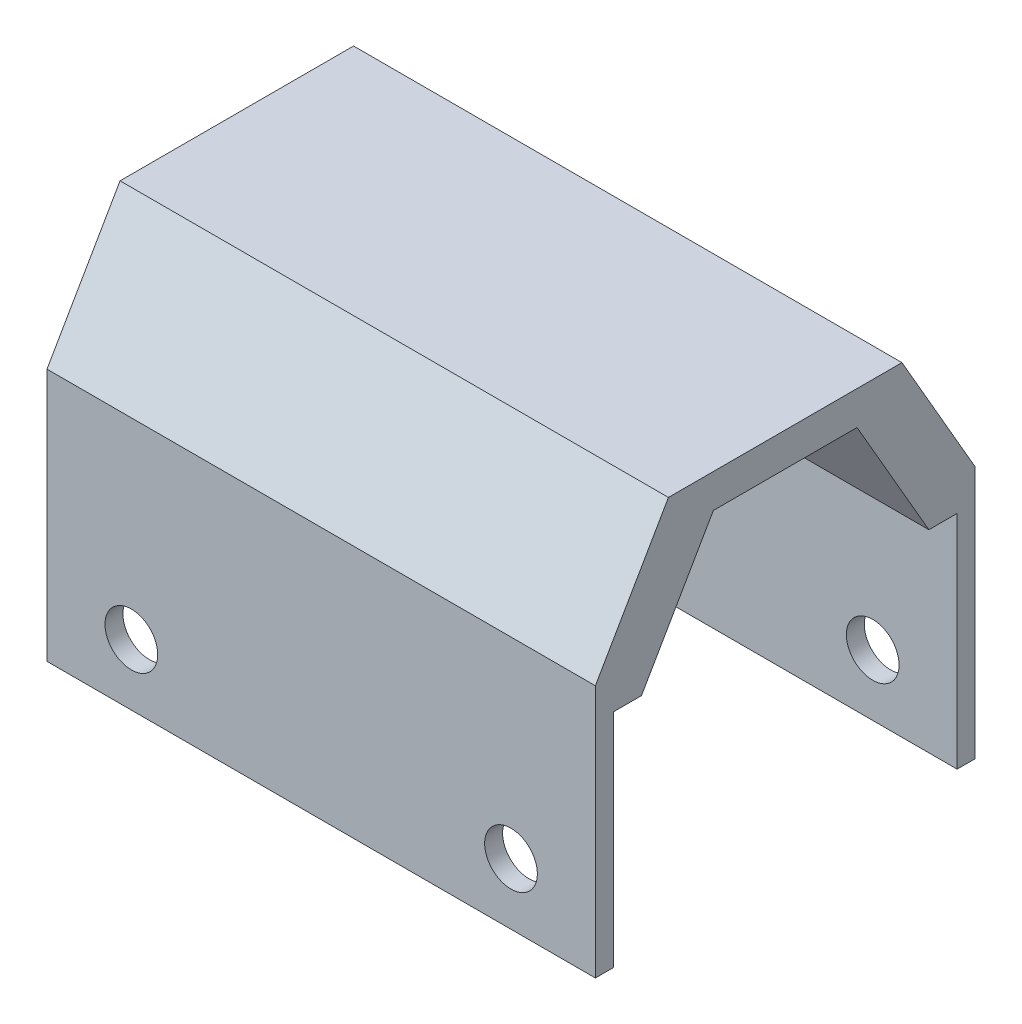
ISO-10303-21;
HEADER;
FILE_DESCRIPTION(('STEP AP214'),'2;1');
FILE_NAME('part.step','',(''),(''),'','','');
FILE_SCHEMA(('AUTOMOTIVE_DESIGN { 1 0 10303 214 1 1 1 1 }'));
ENDSEC;
DATA;
#1=APPLICATION_CONTEXT('core data for automotive mechanical design processes');
#2=APPLICATION_PROTOCOL_DEFINITION('international standard','automotive_design',2000,#1);
#3=PRODUCT_CONTEXT('',#1,'mechanical');
#4=PRODUCT('Part','Part','',(#3));
#5=PRODUCT_RELATED_PRODUCT_CATEGORY('part','',(#4));
#6=PRODUCT_DEFINITION_FORMATION('','',#4);
#7=PRODUCT_DEFINITION_CONTEXT('part definition',#1,'design');
#8=PRODUCT_DEFINITION('design','',#6,#7);
#9=PRODUCT_DEFINITION_SHAPE('','',#8);
#10=(LENGTH_UNIT() NAMED_UNIT(*) SI_UNIT(.MILLI.,.METRE.));
#11=(NAMED_UNIT(*) PLANE_ANGLE_UNIT() SI_UNIT($,.RADIAN.));
#12=(NAMED_UNIT(*) SI_UNIT($,.STERADIAN.) SOLID_ANGLE_UNIT());
#13=UNCERTAINTY_MEASURE_WITH_UNIT(LENGTH_MEASURE(1.E-05),#10,'distance_accuracy_value','');
#14=(GEOMETRIC_REPRESENTATION_CONTEXT(3) GLOBAL_UNCERTAINTY_ASSIGNED_CONTEXT((#13)) GLOBAL_UNIT_ASSIGNED_CONTEXT((#10,
#11,#12)) REPRESENTATION_CONTEXT('',''));
#15=CARTESIAN_POINT('',(0.,0.,0.));
#16=DIRECTION('',(0.,0.,1.));
#17=DIRECTION('',(1.,0.,0.));
#18=AXIS2_PLACEMENT_3D('',#15,#16,#17);
#19=CARTESIAN_POINT('',(-13.,-9.,18.));
#20=DIRECTION('',(0.,1.,0.));
#21=DIRECTION('',(0.,0.,1.));
#22=AXIS2_PLACEMENT_3D('',#19,#20,#21);
#23=PLANE('',#22);
#24=DIRECTION('',(0.,0.,-1.));
#25=VECTOR('',#24,1.);
#26=CARTESIAN_POINT('',(13.,-9.,18.));
#27=LINE('',#26,#25);
#28=CARTESIAN_POINT('',(13.,-9.,0.85));
#29=VERTEX_POINT('',#28);
#30=CARTESIAN_POINT('',(13.,-9.,0.));
#31=VERTEX_POINT('',#30);
#32=EDGE_CURVE('E254',#29,#31,#27,.T.);
#33=ORIENTED_EDGE('',*,*,#32,.F.);
#34=DIRECTION('',(1.,0.,0.));
#35=VECTOR('',#34,1.);
#36=CARTESIAN_POINT('',(-13.,-9.,0.85));
#37=LINE('',#36,#35);
#38=CARTESIAN_POINT('',(-13.,-9.,0.85));
#39=VERTEX_POINT('',#38);
#40=EDGE_CURVE('E225',#39,#29,#37,.T.);
#41=ORIENTED_EDGE('',*,*,#40,.F.);
#42=DIRECTION('',(0.,0.,-1.));
#43=VECTOR('',#42,1.);
#44=CARTESIAN_POINT('',(-13.,-9.,18.));
#45=LINE('',#44,#43);
#46=CARTESIAN_POINT('',(-13.,-9.,0.));
#47=VERTEX_POINT('',#46);
#48=EDGE_CURVE('E267',#39,#47,#45,.T.);
#49=ORIENTED_EDGE('',*,*,#48,.T.);
#50=DIRECTION('',(1.,0.,0.));
#51=VECTOR('',#50,1.);
#52=CARTESIAN_POINT('',(-13.,-9.,0.));
#53=LINE('',#52,#51);
#54=EDGE_CURVE('E248',#47,#31,#53,.T.);
#55=ORIENTED_EDGE('',*,*,#54,.T.);
#56=EDGE_LOOP('',(#33,#41,#49,#55));
#57=FACE_BOUND('',#56,.T.);
#58=ADVANCED_FACE('F44',(#57),#23,.F.);
#59=CARTESIAN_POINT('',(13.,-9.,18.));
#60=DIRECTION('',(-1.,0.,0.));
#61=DIRECTION('',(0.,0.,1.));
#62=AXIS2_PLACEMENT_3D('',#59,#60,#61);
#63=PLANE('',#62);
#64=DIRECTION('',(0.,0.,-1.));
#65=VECTOR('',#64,1.);
#66=CARTESIAN_POINT('',(13.,9.,18.));
#67=LINE('',#66,#65);
#68=CARTESIAN_POINT('',(13.,9.,14.5358983848622));
#69=VERTEX_POINT('',#68);
#70=CARTESIAN_POINT('',(13.,9.,3.46410161513776));
#71=VERTEX_POINT('',#70);
#72=EDGE_CURVE('E276',#69,#71,#67,.T.);
#73=ORIENTED_EDGE('',*,*,#72,.F.);
#74=DIRECTION('',(0.,0.86602540378444,-0.499999999999998));
#75=VECTOR('',#74,1.);
#76=CARTESIAN_POINT('',(13.,2.99999999999996,18.));
#77=LINE('',#76,#75);
#78=CARTESIAN_POINT('',(13.,2.99999999999996,18.));
#79=VERTEX_POINT('',#78);
#80=EDGE_CURVE('E54',#69,#79,#77,.F.);
#81=ORIENTED_EDGE('',*,*,#80,.T.);
#82=DIRECTION('',(0.,1.,0.));
#83=VECTOR('',#82,1.);
#84=CARTESIAN_POINT('',(13.,-9.,18.));
#85=LINE('',#84,#83);
#86=CARTESIAN_POINT('',(13.,-9.,18.));
#87=VERTEX_POINT('',#86);
#88=EDGE_CURVE('E243',#87,#79,#85,.T.);
#89=ORIENTED_EDGE('',*,*,#88,.F.);
#90=CARTESIAN_POINT('',(13.,-9.,17.15));
#91=VERTEX_POINT('',#90);
#92=EDGE_CURVE('E263',#87,#91,#27,.T.);
#93=ORIENTED_EDGE('',*,*,#92,.T.);
#94=DIRECTION('',(0.,-1.,0.));
#95=VECTOR('',#94,1.);
#96=CARTESIAN_POINT('',(13.,-9.,17.15));
#97=LINE('',#96,#95);
#98=CARTESIAN_POINT('',(13.,1.5,17.15));
#99=VERTEX_POINT('',#98);
#100=EDGE_CURVE('E180',#99,#91,#97,.T.);
#101=ORIENTED_EDGE('',*,*,#100,.F.);
#102=DIRECTION('',(0.,0.,1.));
#103=VECTOR('',#102,1.);
#104=CARTESIAN_POINT('',(13.,1.5,17.15));
#105=LINE('',#104,#103);
#106=CARTESIAN_POINT('',(13.,1.5,15.8127331764376));
#107=VERTEX_POINT('',#106);
#108=EDGE_CURVE('E215',#107,#99,#105,.T.);
#109=ORIENTED_EDGE('',*,*,#108,.F.);
#110=DIRECTION('',(0.,-0.866025403784439,0.5));
#111=VECTOR('',#110,1.);
#112=CARTESIAN_POINT('',(13.,7.4,12.4063665882188));
#113=LINE('',#112,#111);
#114=CARTESIAN_POINT('',(13.,7.4,12.4063665882188));
#115=VERTEX_POINT('',#114);
#116=EDGE_CURVE('E211',#115,#107,#113,.T.);
#117=ORIENTED_EDGE('',*,*,#116,.F.);
#118=DIRECTION('',(0.,0.,1.));
#119=VECTOR('',#118,1.);
#120=CARTESIAN_POINT('',(13.,7.4,5.59363341178121));
#121=LINE('',#120,#119);
#122=CARTESIAN_POINT('',(13.,7.4,5.59363341178121));
#123=VERTEX_POINT('',#122);
#124=EDGE_CURVE('E207',#123,#115,#121,.T.);
#125=ORIENTED_EDGE('',*,*,#124,.F.);
#126=DIRECTION('',(0.,0.866025403784438,0.5));
#127=VECTOR('',#126,1.);
#128=CARTESIAN_POINT('',(13.,1.5,2.18726682356241));
#129=LINE('',#128,#127);
#130=CARTESIAN_POINT('',(13.,1.5,2.18726682356241));
#131=VERTEX_POINT('',#130);
#132=EDGE_CURVE('E204',#131,#123,#129,.T.);
#133=ORIENTED_EDGE('',*,*,#132,.F.);
#134=DIRECTION('',(0.,0.,1.));
#135=VECTOR('',#134,1.);
#136=CARTESIAN_POINT('',(13.,1.5,2.18726682356241));
#137=LINE('',#136,#135);
#138=CARTESIAN_POINT('',(13.,1.5,0.850000000000004));
#139=VERTEX_POINT('',#138);
#140=EDGE_CURVE('E155',#139,#131,#137,.T.);
#141=ORIENTED_EDGE('',*,*,#140,.F.);
#142=DIRECTION('',(0.,1.,0.));
#143=VECTOR('',#142,1.);
#144=CARTESIAN_POINT('',(13.,-9.,0.85));
#145=LINE('',#144,#143);
#146=EDGE_CURVE('E176',#29,#139,#145,.T.);
#147=ORIENTED_EDGE('',*,*,#146,.F.);
#148=ORIENTED_EDGE('',*,*,#32,.T.);
#149=DIRECTION('',(0.,1.,0.));
#150=VECTOR('',#149,1.);
#151=CARTESIAN_POINT('',(13.,-9.,0.));
#152=LINE('',#151,#150);
#153=CARTESIAN_POINT('',(13.,2.99999999999996,0.));
#154=VERTEX_POINT('',#153);
#155=EDGE_CURVE('E224',#31,#154,#152,.T.);
#156=ORIENTED_EDGE('',*,*,#155,.T.);
#157=DIRECTION('',(0.,0.86602540378444,0.499999999999998));
#158=VECTOR('',#157,1.);
#159=CARTESIAN_POINT('',(13.,9.,3.46410161513776));
#160=LINE('',#159,#158);
#161=EDGE_CURVE('E66',#154,#71,#160,.T.);
#162=ORIENTED_EDGE('',*,*,#161,.T.);
#163=EDGE_LOOP('',(#73,#81,#89,#93,#101,#109,#117,#125,#133,#141,#147,#148,#156,#162));
#164=FACE_BOUND('',#163,.T.);
#165=ADVANCED_FACE('F310',(#164),#63,.F.);
#166=CARTESIAN_POINT('',(-13.,9.,18.));
#167=DIRECTION('',(0.,-1.,0.));
#168=DIRECTION('',(0.,0.,-1.));
#169=AXIS2_PLACEMENT_3D('',#166,#167,#168);
#170=PLANE('',#169);
#171=DIRECTION('',(0.,0.,-1.));
#172=VECTOR('',#171,1.);
#173=CARTESIAN_POINT('',(-13.,9.,18.));
#174=LINE('',#173,#172);
#175=CARTESIAN_POINT('',(-13.,9.,14.5358983848622));
#176=VERTEX_POINT('',#175);
#177=CARTESIAN_POINT('',(-13.,9.,3.46410161513776));
#178=VERTEX_POINT('',#177);
#179=EDGE_CURVE('E272',#176,#178,#174,.T.);
#180=ORIENTED_EDGE('',*,*,#179,.F.);
#181=DIRECTION('',(1.,0.,0.));
#182=VECTOR('',#181,1.);
#183=CARTESIAN_POINT('',(-13.,9.,14.5358983848622));
#184=LINE('',#183,#182);
#185=EDGE_CURVE('E303',#176,#69,#184,.T.);
#186=ORIENTED_EDGE('',*,*,#185,.T.);
#187=ORIENTED_EDGE('',*,*,#72,.T.);
#188=DIRECTION('',(-1.,0.,0.));
#189=VECTOR('',#188,1.);
#190=CARTESIAN_POINT('',(-13.,9.,3.46410161513776));
#191=LINE('',#190,#189);
#192=EDGE_CURVE('E299',#71,#178,#191,.T.);
#193=ORIENTED_EDGE('',*,*,#192,.T.);
#194=EDGE_LOOP('',(#180,#186,#187,#193));
#195=FACE_BOUND('',#194,.T.);
#196=ADVANCED_FACE('F322',(#195),#170,.F.);
#197=CARTESIAN_POINT('',(-13.,-9.,18.));
#198=DIRECTION('',(1.,0.,0.));
#199=DIRECTION('',(0.,0.,-1.));
#200=AXIS2_PLACEMENT_3D('',#197,#198,#199);
#201=PLANE('',#200);
#202=DIRECTION('',(0.,-1.,0.));
#203=VECTOR('',#202,1.);
#204=CARTESIAN_POINT('',(-13.,-9.,18.));
#205=LINE('',#204,#203);
#206=CARTESIAN_POINT('',(-13.,2.99999999999996,18.));
#207=VERTEX_POINT('',#206);
#208=CARTESIAN_POINT('',(-13.,-9.,18.));
#209=VERTEX_POINT('',#208);
#210=EDGE_CURVE('E247',#207,#209,#205,.T.);
#211=ORIENTED_EDGE('',*,*,#210,.F.);
#212=DIRECTION('',(0.,-0.86602540378444,0.499999999999998));
#213=VECTOR('',#212,1.);
#214=CARTESIAN_POINT('',(-13.,2.99999999999996,18.));
#215=LINE('',#214,#213);
#216=EDGE_CURVE('E296',#207,#176,#215,.F.);
#217=ORIENTED_EDGE('',*,*,#216,.T.);
#218=ORIENTED_EDGE('',*,*,#179,.T.);
#219=DIRECTION('',(0.,-0.86602540378444,-0.499999999999998));
#220=VECTOR('',#219,1.);
#221=CARTESIAN_POINT('',(-13.,9.,3.46410161513776));
#222=LINE('',#221,#220);
#223=CARTESIAN_POINT('',(-13.,2.99999999999996,0.));
#224=VERTEX_POINT('',#223);
#225=EDGE_CURVE('E293',#178,#224,#222,.T.);
#226=ORIENTED_EDGE('',*,*,#225,.T.);
#227=DIRECTION('',(0.,-1.,0.));
#228=VECTOR('',#227,1.);
#229=CARTESIAN_POINT('',(-13.,-9.,0.));
#230=LINE('',#229,#228);
#231=EDGE_CURVE('E257',#224,#47,#230,.T.);
#232=ORIENTED_EDGE('',*,*,#231,.T.);
#233=ORIENTED_EDGE('',*,*,#48,.F.);
#234=DIRECTION('',(0.,1.,0.));
#235=VECTOR('',#234,1.);
#236=CARTESIAN_POINT('',(-13.,-9.,0.85));
#237=LINE('',#236,#235);
#238=CARTESIAN_POINT('',(-13.,1.5,0.850000000000004));
#239=VERTEX_POINT('',#238);
#240=EDGE_CURVE('E161',#39,#239,#237,.T.);
#241=ORIENTED_EDGE('',*,*,#240,.T.);
#242=DIRECTION('',(0.,0.,1.));
#243=VECTOR('',#242,1.);
#244=CARTESIAN_POINT('',(-13.,1.5,2.18726682356241));
#245=LINE('',#244,#243);
#246=CARTESIAN_POINT('',(-13.,1.5,2.18726682356241));
#247=VERTEX_POINT('',#246);
#248=EDGE_CURVE('E152',#239,#247,#245,.T.);
#249=ORIENTED_EDGE('',*,*,#248,.T.);
#250=DIRECTION('',(0.,0.866025403784438,0.5));
#251=VECTOR('',#250,1.);
#252=CARTESIAN_POINT('',(-13.,1.5,2.18726682356241));
#253=LINE('',#252,#251);
#254=CARTESIAN_POINT('',(-13.,7.4,5.59363341178121));
#255=VERTEX_POINT('',#254);
#256=EDGE_CURVE('E164',#247,#255,#253,.T.);
#257=ORIENTED_EDGE('',*,*,#256,.T.);
#258=DIRECTION('',(0.,0.,1.));
#259=VECTOR('',#258,1.);
#260=CARTESIAN_POINT('',(-13.,7.4,5.59363341178121));
#261=LINE('',#260,#259);
#262=CARTESIAN_POINT('',(-13.,7.4,12.4063665882188));
#263=VERTEX_POINT('',#262);
#264=EDGE_CURVE('E170',#255,#263,#261,.T.);
#265=ORIENTED_EDGE('',*,*,#264,.T.);
#266=DIRECTION('',(0.,-0.866025403784439,0.5));
#267=VECTOR('',#266,1.);
#268=CARTESIAN_POINT('',(-13.,7.4,12.4063665882188));
#269=LINE('',#268,#267);
#270=CARTESIAN_POINT('',(-13.,1.5,15.8127331764376));
#271=VERTEX_POINT('',#270);
#272=EDGE_CURVE('E188',#263,#271,#269,.T.);
#273=ORIENTED_EDGE('',*,*,#272,.T.);
#274=DIRECTION('',(0.,0.,1.));
#275=VECTOR('',#274,1.);
#276=CARTESIAN_POINT('',(-13.,1.5,17.15));
#277=LINE('',#276,#275);
#278=CARTESIAN_POINT('',(-13.,1.5,17.15));
#279=VERTEX_POINT('',#278);
#280=EDGE_CURVE('E192',#271,#279,#277,.T.);
#281=ORIENTED_EDGE('',*,*,#280,.T.);
#282=DIRECTION('',(0.,-1.,0.));
#283=VECTOR('',#282,1.);
#284=CARTESIAN_POINT('',(-13.,-9.,17.15));
#285=LINE('',#284,#283);
#286=CARTESIAN_POINT('',(-13.,-9.,17.15));
#287=VERTEX_POINT('',#286);
#288=EDGE_CURVE('E196',#279,#287,#285,.T.);
#289=ORIENTED_EDGE('',*,*,#288,.T.);
#290=EDGE_CURVE('E268',#209,#287,#45,.T.);
#291=ORIENTED_EDGE('',*,*,#290,.F.);
#292=EDGE_LOOP('',(#211,#217,#218,#226,#232,#233,#241,#249,#257,#265,#273,#281,#289,#291));
#293=FACE_BOUND('',#292,.T.);
#294=ADVANCED_FACE('F173',(#293),#201,.F.);
#295=ORIENTED_EDGE('',*,*,#290,.T.);
#296=DIRECTION('',(1.,0.,0.));
#297=VECTOR('',#296,1.);
#298=CARTESIAN_POINT('',(-13.,-9.,17.15));
#299=LINE('',#298,#297);
#300=EDGE_CURVE('E228',#287,#91,#299,.T.);
#301=ORIENTED_EDGE('',*,*,#300,.T.);
#302=ORIENTED_EDGE('',*,*,#92,.F.);
#303=DIRECTION('',(1.,0.,0.));
#304=VECTOR('',#303,1.);
#305=CARTESIAN_POINT('',(-13.,-9.,18.));
#306=LINE('',#305,#304);
#307=EDGE_CURVE('E251',#209,#87,#306,.T.);
#308=ORIENTED_EDGE('',*,*,#307,.F.);
#309=EDGE_LOOP('',(#295,#301,#302,#308));
#310=FACE_BOUND('',#309,.T.);
#311=ADVANCED_FACE('F353',(#310),#23,.F.);
#312=CARTESIAN_POINT('',(0.,0.,18.));
#313=DIRECTION('',(0.,0.,-1.));
#314=DIRECTION('',(-1.,0.,0.));
#315=AXIS2_PLACEMENT_3D('',#312,#313,#314);
#316=PLANE('',#315);
#317=CARTESIAN_POINT('',(-8.99999999999999,-6.1,18.));
#318=DIRECTION('',(0.,0.,1.));
#319=DIRECTION('',(1.,0.,0.));
#320=AXIS2_PLACEMENT_3D('',#317,#318,#319);
#321=CIRCLE('',#320,1.25);
#322=CARTESIAN_POINT('',(-7.74999999999999,-6.1,18.));
#323=VERTEX_POINT('',#322);
#324=EDGE_CURVE('E407',#323,#323,#321,.T.);
#325=ORIENTED_EDGE('',*,*,#324,.F.);
#326=EDGE_LOOP('',(#325));
#327=FACE_BOUND('',#326,.T.);
#328=CARTESIAN_POINT('',(9.00000000000001,-6.1,18.));
#329=DIRECTION('',(0.,0.,1.));
#330=DIRECTION('',(1.,0.,0.));
#331=AXIS2_PLACEMENT_3D('',#328,#329,#330);
#332=CIRCLE('',#331,1.25);
#333=CARTESIAN_POINT('',(10.25,-6.1,18.));
#334=VERTEX_POINT('',#333);
#335=EDGE_CURVE('E403',#334,#334,#332,.T.);
#336=ORIENTED_EDGE('',*,*,#335,.F.);
#337=EDGE_LOOP('',(#336));
#338=FACE_BOUND('',#337,.T.);
#339=ORIENTED_EDGE('',*,*,#88,.T.);
#340=DIRECTION('',(-1.,0.,0.));
#341=VECTOR('',#340,1.);
#342=CARTESIAN_POINT('',(0.,2.99999999999996,18.));
#343=LINE('',#342,#341);
#344=EDGE_CURVE('E279',#79,#207,#343,.T.);
#345=ORIENTED_EDGE('',*,*,#344,.T.);
#346=ORIENTED_EDGE('',*,*,#210,.T.);
#347=ORIENTED_EDGE('',*,*,#307,.T.);
#348=EDGE_LOOP('',(#339,#345,#346,#347));
#349=FACE_BOUND('',#348,.T.);
#350=ADVANCED_FACE('F315',(#327,#338,#349),#316,.F.);
#351=CARTESIAN_POINT('',(0.,0.,0.));
#352=DIRECTION('',(0.,0.,-1.));
#353=DIRECTION('',(-1.,0.,0.));
#354=AXIS2_PLACEMENT_3D('',#351,#352,#353);
#355=PLANE('',#354);
#356=CARTESIAN_POINT('',(-8.99999999999999,-6.1,0.));
#357=DIRECTION('',(0.,0.,1.));
#358=DIRECTION('',(1.,0.,0.));
#359=AXIS2_PLACEMENT_3D('',#356,#357,#358);
#360=CIRCLE('',#359,1.25);
#361=CARTESIAN_POINT('',(-7.74999999999999,-6.1,0.));
#362=VERTEX_POINT('',#361);
#363=EDGE_CURVE('E285',#362,#362,#360,.T.);
#364=ORIENTED_EDGE('',*,*,#363,.T.);
#365=EDGE_LOOP('',(#364));
#366=FACE_BOUND('',#365,.T.);
#367=CARTESIAN_POINT('',(9.00000000000001,-6.1,0.));
#368=DIRECTION('',(0.,0.,1.));
#369=DIRECTION('',(1.,0.,0.));
#370=AXIS2_PLACEMENT_3D('',#367,#368,#369);
#371=CIRCLE('',#370,1.25);
#372=CARTESIAN_POINT('',(10.25,-6.1,0.));
#373=VERTEX_POINT('',#372);
#374=EDGE_CURVE('E400',#373,#373,#371,.T.);
#375=ORIENTED_EDGE('',*,*,#374,.T.);
#376=EDGE_LOOP('',(#375));
#377=FACE_BOUND('',#376,.T.);
#378=ORIENTED_EDGE('',*,*,#231,.F.);
#379=DIRECTION('',(1.,0.,0.));
#380=VECTOR('',#379,1.);
#381=CARTESIAN_POINT('',(13.,2.99999999999996,0.));
#382=LINE('',#381,#380);
#383=EDGE_CURVE('E11',#224,#154,#382,.T.);
#384=ORIENTED_EDGE('',*,*,#383,.T.);
#385=ORIENTED_EDGE('',*,*,#155,.F.);
#386=ORIENTED_EDGE('',*,*,#54,.F.);
#387=EDGE_LOOP('',(#378,#384,#385,#386));
#388=FACE_BOUND('',#387,.T.);
#389=ADVANCED_FACE('F327',(#366,#377,#388),#355,.T.);
#390=CARTESIAN_POINT('',(-13.,1.5,2.18726682356241));
#391=DIRECTION('',(0.,1.,0.));
#392=DIRECTION('',(0.,0.,1.));
#393=AXIS2_PLACEMENT_3D('',#390,#391,#392);
#394=PLANE('',#393);
#395=ORIENTED_EDGE('',*,*,#140,.T.);
#396=DIRECTION('',(1.,0.,0.));
#397=VECTOR('',#396,1.);
#398=CARTESIAN_POINT('',(-13.,1.5,2.18726682356241));
#399=LINE('',#398,#397);
#400=EDGE_CURVE('E148',#247,#131,#399,.T.);
#401=ORIENTED_EDGE('',*,*,#400,.F.);
#402=ORIENTED_EDGE('',*,*,#248,.F.);
#403=DIRECTION('',(1.,0.,0.));
#404=VECTOR('',#403,1.);
#405=CARTESIAN_POINT('',(-13.,1.5,0.850000000000004));
#406=LINE('',#405,#404);
#407=EDGE_CURVE('E221',#239,#139,#406,.T.);
#408=ORIENTED_EDGE('',*,*,#407,.T.);
#409=EDGE_LOOP('',(#395,#401,#402,#408));
#410=FACE_BOUND('',#409,.T.);
#411=ADVANCED_FACE('F150',(#410),#394,.F.);
#412=CARTESIAN_POINT('',(-13.,-9.,0.85));
#413=DIRECTION('',(0.,0.,-1.));
#414=DIRECTION('',(0.,1.,0.));
#415=AXIS2_PLACEMENT_3D('',#412,#413,#414);
#416=PLANE('',#415);
#417=CARTESIAN_POINT('',(-8.99999999999999,-6.1,0.850000000000001));
#418=DIRECTION('',(0.,0.,-1.));
#419=DIRECTION('',(0.,1.,0.));
#420=AXIS2_PLACEMENT_3D('',#417,#418,#419);
#421=CIRCLE('',#420,1.25);
#422=CARTESIAN_POINT('',(-8.99999999999999,-4.85,0.850000000000001));
#423=VERTEX_POINT('',#422);
#424=EDGE_CURVE('E183',#423,#423,#421,.T.);
#425=ORIENTED_EDGE('',*,*,#424,.T.);
#426=EDGE_LOOP('',(#425));
#427=FACE_BOUND('',#426,.T.);
#428=CARTESIAN_POINT('',(9.00000000000001,-6.1,0.850000000000001));
#429=DIRECTION('',(0.,0.,-1.));
#430=DIRECTION('',(0.,1.,0.));
#431=AXIS2_PLACEMENT_3D('',#428,#429,#430);
#432=CIRCLE('',#431,1.25);
#433=CARTESIAN_POINT('',(9.00000000000001,-4.85,0.850000000000001));
#434=VERTEX_POINT('',#433);
#435=EDGE_CURVE('E284',#434,#434,#432,.T.);
#436=ORIENTED_EDGE('',*,*,#435,.T.);
#437=EDGE_LOOP('',(#436));
#438=FACE_BOUND('',#437,.T.);
#439=ORIENTED_EDGE('',*,*,#146,.T.);
#440=ORIENTED_EDGE('',*,*,#407,.F.);
#441=ORIENTED_EDGE('',*,*,#240,.F.);
#442=ORIENTED_EDGE('',*,*,#40,.T.);
#443=EDGE_LOOP('',(#439,#440,#441,#442));
#444=FACE_BOUND('',#443,.T.);
#445=ADVANCED_FACE('F335',(#427,#438,#444),#416,.F.);
#446=CARTESIAN_POINT('',(-13.,-9.,17.15));
#447=DIRECTION('',(0.,0.,1.));
#448=DIRECTION('',(1.,0.,0.));
#449=AXIS2_PLACEMENT_3D('',#446,#447,#448);
#450=PLANE('',#449);
#451=CARTESIAN_POINT('',(-8.99999999999999,-6.1,17.15));
#452=DIRECTION('',(0.,0.,1.));
#453=DIRECTION('',(1.,0.,0.));
#454=AXIS2_PLACEMENT_3D('',#451,#452,#453);
#455=CIRCLE('',#454,1.25);
#456=CARTESIAN_POINT('',(-7.74999999999999,-6.1,17.15));
#457=VERTEX_POINT('',#456);
#458=EDGE_CURVE('E286',#457,#457,#455,.T.);
#459=ORIENTED_EDGE('',*,*,#458,.T.);
#460=EDGE_LOOP('',(#459));
#461=FACE_BOUND('',#460,.T.);
#462=CARTESIAN_POINT('',(9.00000000000001,-6.1,17.15));
#463=DIRECTION('',(0.,0.,1.));
#464=DIRECTION('',(1.,0.,0.));
#465=AXIS2_PLACEMENT_3D('',#462,#463,#464);
#466=CIRCLE('',#465,1.25);
#467=CARTESIAN_POINT('',(10.25,-6.1,17.15));
#468=VERTEX_POINT('',#467);
#469=EDGE_CURVE('E280',#468,#468,#466,.T.);
#470=ORIENTED_EDGE('',*,*,#469,.T.);
#471=EDGE_LOOP('',(#470));
#472=FACE_BOUND('',#471,.T.);
#473=ORIENTED_EDGE('',*,*,#100,.T.);
#474=ORIENTED_EDGE('',*,*,#300,.F.);
#475=ORIENTED_EDGE('',*,*,#288,.F.);
#476=DIRECTION('',(1.,0.,0.));
#477=VECTOR('',#476,1.);
#478=CARTESIAN_POINT('',(-13.,1.5,17.15));
#479=LINE('',#478,#477);
#480=EDGE_CURVE('E232',#279,#99,#479,.T.);
#481=ORIENTED_EDGE('',*,*,#480,.T.);
#482=EDGE_LOOP('',(#473,#474,#475,#481));
#483=FACE_BOUND('',#482,.T.);
#484=ADVANCED_FACE('F337',(#461,#472,#483),#450,.F.);
#485=CARTESIAN_POINT('',(-13.,1.5,17.15));
#486=DIRECTION('',(0.,1.,0.));
#487=DIRECTION('',(0.,0.,1.));
#488=AXIS2_PLACEMENT_3D('',#485,#486,#487);
#489=PLANE('',#488);
#490=ORIENTED_EDGE('',*,*,#108,.T.);
#491=ORIENTED_EDGE('',*,*,#480,.F.);
#492=ORIENTED_EDGE('',*,*,#280,.F.);
#493=DIRECTION('',(1.,0.,0.));
#494=VECTOR('',#493,1.);
#495=CARTESIAN_POINT('',(-13.,1.5,15.8127331764376));
#496=LINE('',#495,#494);
#497=EDGE_CURVE('E235',#271,#107,#496,.T.);
#498=ORIENTED_EDGE('',*,*,#497,.T.);
#499=EDGE_LOOP('',(#490,#491,#492,#498));
#500=FACE_BOUND('',#499,.T.);
#501=ADVANCED_FACE('F344',(#500),#489,.F.);
#502=CARTESIAN_POINT('',(-13.,7.4,12.4063665882188));
#503=DIRECTION('',(0.,0.5,0.866025403784439));
#504=DIRECTION('',(0.,-0.866025403784439,0.5));
#505=AXIS2_PLACEMENT_3D('',#502,#503,#504);
#506=PLANE('',#505);
#507=ORIENTED_EDGE('',*,*,#116,.T.);
#508=ORIENTED_EDGE('',*,*,#497,.F.);
#509=ORIENTED_EDGE('',*,*,#272,.F.);
#510=DIRECTION('',(1.,0.,0.));
#511=VECTOR('',#510,1.);
#512=CARTESIAN_POINT('',(-13.,7.4,12.4063665882188));
#513=LINE('',#512,#511);
#514=EDGE_CURVE('E238',#263,#115,#513,.T.);
#515=ORIENTED_EDGE('',*,*,#514,.T.);
#516=EDGE_LOOP('',(#507,#508,#509,#515));
#517=FACE_BOUND('',#516,.T.);
#518=ADVANCED_FACE('F378',(#517),#506,.F.);
#519=CARTESIAN_POINT('',(-13.,7.4,5.59363341178121));
#520=DIRECTION('',(0.,1.,0.));
#521=DIRECTION('',(0.,0.,1.));
#522=AXIS2_PLACEMENT_3D('',#519,#520,#521);
#523=PLANE('',#522);
#524=ORIENTED_EDGE('',*,*,#124,.T.);
#525=ORIENTED_EDGE('',*,*,#514,.F.);
#526=ORIENTED_EDGE('',*,*,#264,.F.);
#527=DIRECTION('',(1.,0.,0.));
#528=VECTOR('',#527,1.);
#529=CARTESIAN_POINT('',(-13.,7.4,5.59363341178121));
#530=LINE('',#529,#528);
#531=EDGE_CURVE('E160',#255,#123,#530,.T.);
#532=ORIENTED_EDGE('',*,*,#531,.T.);
#533=EDGE_LOOP('',(#524,#525,#526,#532));
#534=FACE_BOUND('',#533,.T.);
#535=ADVANCED_FACE('F380',(#534),#523,.F.);
#536=CARTESIAN_POINT('',(-13.,1.5,2.18726682356241));
#537=DIRECTION('',(0.,0.5,-0.866025403784438));
#538=DIRECTION('',(0.,0.866025403784439,0.5));
#539=AXIS2_PLACEMENT_3D('',#536,#537,#538);
#540=PLANE('',#539);
#541=ORIENTED_EDGE('',*,*,#132,.T.);
#542=ORIENTED_EDGE('',*,*,#531,.F.);
#543=ORIENTED_EDGE('',*,*,#256,.F.);
#544=ORIENTED_EDGE('',*,*,#400,.T.);
#545=EDGE_LOOP('',(#541,#542,#543,#544));
#546=FACE_BOUND('',#545,.T.);
#547=ADVANCED_FACE('F165',(#546),#540,.F.);
#548=CARTESIAN_POINT('',(9.00000000000001,-6.1,0.));
#549=DIRECTION('',(0.,0.,1.));
#550=DIRECTION('',(1.,0.,0.));
#551=AXIS2_PLACEMENT_3D('',#548,#549,#550);
#552=CYLINDRICAL_SURFACE('',#551,1.25);
#553=ORIENTED_EDGE('',*,*,#335,.T.);
#554=EDGE_LOOP('',(#553));
#555=FACE_BOUND('',#554,.T.);
#556=ORIENTED_EDGE('',*,*,#469,.F.);
#557=EDGE_LOOP('',(#556));
#558=FACE_BOUND('',#557,.T.);
#559=ADVANCED_FACE('F387',(#555,#558),#552,.F.);
#560=CARTESIAN_POINT('',(-8.99999999999999,-6.1,0.));
#561=DIRECTION('',(0.,0.,1.));
#562=DIRECTION('',(1.,0.,0.));
#563=AXIS2_PLACEMENT_3D('',#560,#561,#562);
#564=CYLINDRICAL_SURFACE('',#563,1.25);
#565=ORIENTED_EDGE('',*,*,#324,.T.);
#566=EDGE_LOOP('',(#565));
#567=FACE_BOUND('',#566,.T.);
#568=ORIENTED_EDGE('',*,*,#458,.F.);
#569=EDGE_LOOP('',(#568));
#570=FACE_BOUND('',#569,.T.);
#571=ADVANCED_FACE('F417',(#567,#570),#564,.F.);
#572=ORIENTED_EDGE('',*,*,#374,.F.);
#573=EDGE_LOOP('',(#572));
#574=FACE_BOUND('',#573,.T.);
#575=ORIENTED_EDGE('',*,*,#435,.F.);
#576=EDGE_LOOP('',(#575));
#577=FACE_BOUND('',#576,.T.);
#578=ADVANCED_FACE('F414',(#574,#577),#552,.F.);
#579=ORIENTED_EDGE('',*,*,#363,.F.);
#580=EDGE_LOOP('',(#579));
#581=FACE_BOUND('',#580,.T.);
#582=ORIENTED_EDGE('',*,*,#424,.F.);
#583=EDGE_LOOP('',(#582));
#584=FACE_BOUND('',#583,.T.);
#585=ADVANCED_FACE('F416',(#581,#584),#564,.F.);
#586=CARTESIAN_POINT('',(0.,2.99999999999996,18.));
#587=DIRECTION('',(0.,-0.499999999999998,-0.86602540378444));
#588=DIRECTION('',(-1.,0.,0.));
#589=AXIS2_PLACEMENT_3D('',#586,#587,#588);
#590=PLANE('',#589);
#591=ORIENTED_EDGE('',*,*,#80,.F.);
#592=ORIENTED_EDGE('',*,*,#185,.F.);
#593=ORIENTED_EDGE('',*,*,#216,.F.);
#594=ORIENTED_EDGE('',*,*,#344,.F.);
#595=EDGE_LOOP('',(#591,#592,#593,#594));
#596=FACE_BOUND('',#595,.T.);
#597=ADVANCED_FACE('F318',(#596),#590,.F.);
#598=CARTESIAN_POINT('',(-13.,9.,3.46410161513776));
#599=DIRECTION('',(0.,0.499999999999998,-0.86602540378444));
#600=DIRECTION('',(1.,0.,0.));
#601=AXIS2_PLACEMENT_3D('',#598,#599,#600);
#602=PLANE('',#601);
#603=ORIENTED_EDGE('',*,*,#161,.F.);
#604=ORIENTED_EDGE('',*,*,#383,.F.);
#605=ORIENTED_EDGE('',*,*,#225,.F.);
#606=ORIENTED_EDGE('',*,*,#192,.F.);
#607=EDGE_LOOP('',(#603,#604,#605,#606));
#608=FACE_BOUND('',#607,.T.);
#609=ADVANCED_FACE('F47',(#608),#602,.T.);
#610=CLOSED_SHELL('',(#58,#165,#196,#294,#311,#350,#389,#411,#445,#484,#501,#518,#535,#547,#559,
#571,#578,#585,#597,#609));
#611=MANIFOLD_SOLID_BREP('B2',#610);
#612=ADVANCED_BREP_SHAPE_REPRESENTATION('',(#18,#611),#14);
#613=SHAPE_DEFINITION_REPRESENTATION(#9,#612);
ENDSEC;
END-ISO-10303-21;
